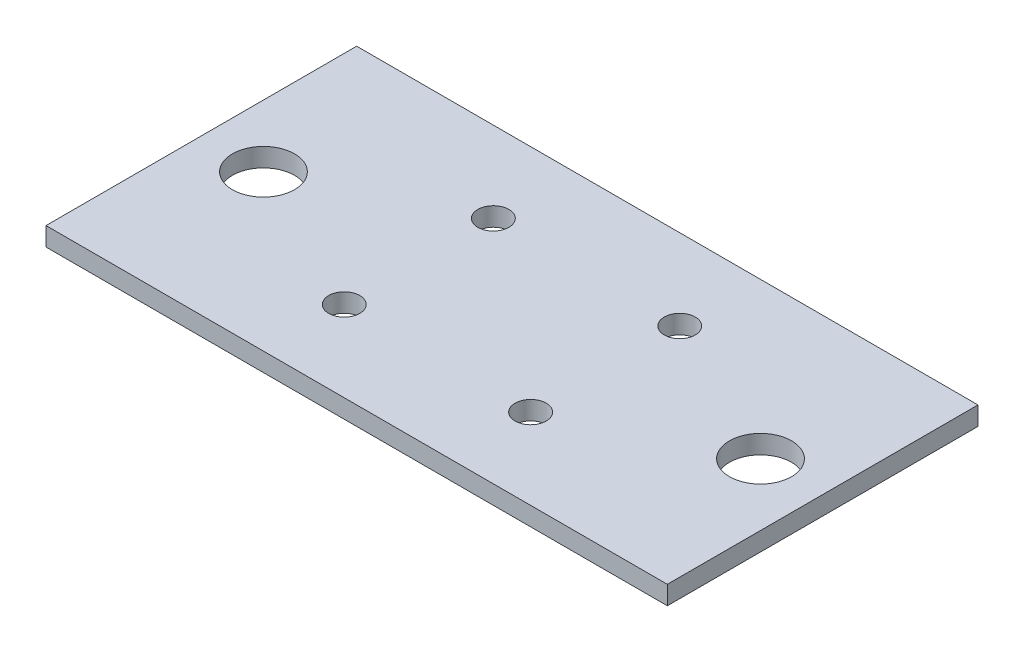
ISO-10303-21;
HEADER;
FILE_DESCRIPTION(('STEP AP214'),'2;1');
FILE_NAME('part.step','',(''),(''),'','','');
FILE_SCHEMA(('AUTOMOTIVE_DESIGN { 1 0 10303 214 1 1 1 1 }'));
ENDSEC;
DATA;
#1=APPLICATION_CONTEXT('core data for automotive mechanical design processes');
#2=APPLICATION_PROTOCOL_DEFINITION('international standard','automotive_design',2000,#1);
#3=PRODUCT_CONTEXT('',#1,'mechanical');
#4=PRODUCT('Part','Part','',(#3));
#5=PRODUCT_RELATED_PRODUCT_CATEGORY('part','',(#4));
#6=PRODUCT_DEFINITION_FORMATION('','',#4);
#7=PRODUCT_DEFINITION_CONTEXT('part definition',#1,'design');
#8=PRODUCT_DEFINITION('design','',#6,#7);
#9=PRODUCT_DEFINITION_SHAPE('','',#8);
#10=(LENGTH_UNIT() NAMED_UNIT(*) SI_UNIT(.MILLI.,.METRE.));
#11=(NAMED_UNIT(*) PLANE_ANGLE_UNIT() SI_UNIT($,.RADIAN.));
#12=(NAMED_UNIT(*) SI_UNIT($,.STERADIAN.) SOLID_ANGLE_UNIT());
#13=UNCERTAINTY_MEASURE_WITH_UNIT(LENGTH_MEASURE(1.E-05),#10,'distance_accuracy_value','');
#14=(GEOMETRIC_REPRESENTATION_CONTEXT(3) GLOBAL_UNCERTAINTY_ASSIGNED_CONTEXT((#13)) GLOBAL_UNIT_ASSIGNED_CONTEXT((#10,
#11,#12)) REPRESENTATION_CONTEXT('',''));
#15=CARTESIAN_POINT('',(0.,0.,0.));
#16=DIRECTION('',(0.,0.,1.));
#17=DIRECTION('',(1.,0.,0.));
#18=AXIS2_PLACEMENT_3D('',#15,#16,#17);
#19=CARTESIAN_POINT('',(50.,3.,-25.));
#20=DIRECTION('',(-1.,0.,0.));
#21=DIRECTION('',(0.,0.,1.));
#22=AXIS2_PLACEMENT_3D('',#19,#20,#21);
#23=PLANE('',#22);
#24=DIRECTION('',(0.,0.,-1.));
#25=VECTOR('',#24,1.);
#26=CARTESIAN_POINT('',(50.,0.,-25.));
#27=LINE('',#26,#25);
#28=CARTESIAN_POINT('',(50.,0.,25.));
#29=VERTEX_POINT('',#28);
#30=CARTESIAN_POINT('',(50.,0.,-25.));
#31=VERTEX_POINT('',#30);
#32=EDGE_CURVE('E96',#29,#31,#27,.T.);
#33=ORIENTED_EDGE('',*,*,#32,.T.);
#34=DIRECTION('',(0.,-1.,0.));
#35=VECTOR('',#34,1.);
#36=CARTESIAN_POINT('',(50.,3.,-25.));
#37=LINE('',#36,#35);
#38=CARTESIAN_POINT('',(50.,3.,-25.));
#39=VERTEX_POINT('',#38);
#40=EDGE_CURVE('E11',#39,#31,#37,.T.);
#41=ORIENTED_EDGE('',*,*,#40,.F.);
#42=DIRECTION('',(0.,0.,-1.));
#43=VECTOR('',#42,1.);
#44=CARTESIAN_POINT('',(50.,3.,-25.));
#45=LINE('',#44,#43);
#46=CARTESIAN_POINT('',(50.,3.,25.));
#47=VERTEX_POINT('',#46);
#48=EDGE_CURVE('E84',#47,#39,#45,.T.);
#49=ORIENTED_EDGE('',*,*,#48,.F.);
#50=DIRECTION('',(0.,-1.,0.));
#51=VECTOR('',#50,1.);
#52=CARTESIAN_POINT('',(50.,3.,25.));
#53=LINE('',#52,#51);
#54=EDGE_CURVE('E92',#47,#29,#53,.T.);
#55=ORIENTED_EDGE('',*,*,#54,.T.);
#56=EDGE_LOOP('',(#33,#41,#49,#55));
#57=FACE_BOUND('',#56,.T.);
#58=ADVANCED_FACE('F33',(#57),#23,.F.);
#59=CARTESIAN_POINT('',(-50.,3.,-25.));
#60=DIRECTION('',(0.,0.,1.));
#61=DIRECTION('',(1.,0.,0.));
#62=AXIS2_PLACEMENT_3D('',#59,#60,#61);
#63=PLANE('',#62);
#64=DIRECTION('',(-1.,0.,0.));
#65=VECTOR('',#64,1.);
#66=CARTESIAN_POINT('',(-50.,0.,-25.));
#67=LINE('',#66,#65);
#68=CARTESIAN_POINT('',(-50.,0.,-25.));
#69=VERTEX_POINT('',#68);
#70=EDGE_CURVE('E88',#31,#69,#67,.T.);
#71=ORIENTED_EDGE('',*,*,#70,.T.);
#72=DIRECTION('',(0.,-1.,0.));
#73=VECTOR('',#72,1.);
#74=CARTESIAN_POINT('',(-50.,3.,-25.));
#75=LINE('',#74,#73);
#76=CARTESIAN_POINT('',(-50.,3.,-25.));
#77=VERTEX_POINT('',#76);
#78=EDGE_CURVE('E41',#77,#69,#75,.T.);
#79=ORIENTED_EDGE('',*,*,#78,.F.);
#80=DIRECTION('',(-1.,0.,0.));
#81=VECTOR('',#80,1.);
#82=CARTESIAN_POINT('',(-50.,3.,-25.));
#83=LINE('',#82,#81);
#84=EDGE_CURVE('E79',#39,#77,#83,.T.);
#85=ORIENTED_EDGE('',*,*,#84,.F.);
#86=ORIENTED_EDGE('',*,*,#40,.T.);
#87=EDGE_LOOP('',(#71,#79,#85,#86));
#88=FACE_BOUND('',#87,.T.);
#89=ADVANCED_FACE('F87',(#88),#63,.F.);
#90=CARTESIAN_POINT('',(-50.,3.,-25.));
#91=DIRECTION('',(1.,0.,0.));
#92=DIRECTION('',(0.,0.,-1.));
#93=AXIS2_PLACEMENT_3D('',#90,#91,#92);
#94=PLANE('',#93);
#95=DIRECTION('',(0.,0.,1.));
#96=VECTOR('',#95,1.);
#97=CARTESIAN_POINT('',(-50.,0.,-25.));
#98=LINE('',#97,#96);
#99=CARTESIAN_POINT('',(-50.,0.,25.));
#100=VERTEX_POINT('',#99);
#101=EDGE_CURVE('E66',#69,#100,#98,.T.);
#102=ORIENTED_EDGE('',*,*,#101,.T.);
#103=DIRECTION('',(0.,-1.,0.));
#104=VECTOR('',#103,1.);
#105=CARTESIAN_POINT('',(-50.,3.,25.));
#106=LINE('',#105,#104);
#107=CARTESIAN_POINT('',(-50.,3.,25.));
#108=VERTEX_POINT('',#107);
#109=EDGE_CURVE('E89',#108,#100,#106,.T.);
#110=ORIENTED_EDGE('',*,*,#109,.F.);
#111=DIRECTION('',(0.,0.,1.));
#112=VECTOR('',#111,1.);
#113=CARTESIAN_POINT('',(-50.,3.,-25.));
#114=LINE('',#113,#112);
#115=EDGE_CURVE('E82',#77,#108,#114,.T.);
#116=ORIENTED_EDGE('',*,*,#115,.F.);
#117=ORIENTED_EDGE('',*,*,#78,.T.);
#118=EDGE_LOOP('',(#102,#110,#116,#117));
#119=FACE_BOUND('',#118,.T.);
#120=ADVANCED_FACE('F90',(#119),#94,.F.);
#121=CARTESIAN_POINT('',(-50.,3.,25.));
#122=DIRECTION('',(0.,0.,-1.));
#123=DIRECTION('',(-1.,0.,0.));
#124=AXIS2_PLACEMENT_3D('',#121,#122,#123);
#125=PLANE('',#124);
#126=DIRECTION('',(1.,0.,0.));
#127=VECTOR('',#126,1.);
#128=CARTESIAN_POINT('',(-50.,0.,25.));
#129=LINE('',#128,#127);
#130=EDGE_CURVE('E72',#100,#29,#129,.T.);
#131=ORIENTED_EDGE('',*,*,#130,.T.);
#132=ORIENTED_EDGE('',*,*,#54,.F.);
#133=DIRECTION('',(1.,0.,0.));
#134=VECTOR('',#133,1.);
#135=CARTESIAN_POINT('',(-50.,3.,25.));
#136=LINE('',#135,#134);
#137=EDGE_CURVE('E49',#108,#47,#136,.T.);
#138=ORIENTED_EDGE('',*,*,#137,.F.);
#139=ORIENTED_EDGE('',*,*,#109,.T.);
#140=EDGE_LOOP('',(#131,#132,#138,#139));
#141=FACE_BOUND('',#140,.T.);
#142=ADVANCED_FACE('F104',(#141),#125,.F.);
#143=CARTESIAN_POINT('',(0.,3.,0.));
#144=DIRECTION('',(0.,1.,0.));
#145=DIRECTION('',(0.,0.,1.));
#146=AXIS2_PLACEMENT_3D('',#143,#144,#145);
#147=PLANE('',#146);
#148=CARTESIAN_POINT('',(-40.,3.,0.));
#149=DIRECTION('',(0.,1.,0.));
#150=DIRECTION('',(0.,0.,1.));
#151=AXIS2_PLACEMENT_3D('',#148,#149,#150);
#152=CIRCLE('',#151,5.);
#153=CARTESIAN_POINT('',(-40.,3.,5.));
#154=VERTEX_POINT('',#153);
#155=EDGE_CURVE('E123',#154,#154,#152,.T.);
#156=ORIENTED_EDGE('',*,*,#155,.F.);
#157=EDGE_LOOP('',(#156));
#158=FACE_BOUND('',#157,.T.);
#159=CARTESIAN_POINT('',(15.,3.,12.));
#160=DIRECTION('',(0.,1.,0.));
#161=DIRECTION('',(0.,0.,1.));
#162=AXIS2_PLACEMENT_3D('',#159,#160,#161);
#163=CIRCLE('',#162,2.5);
#164=CARTESIAN_POINT('',(15.,3.,14.5));
#165=VERTEX_POINT('',#164);
#166=EDGE_CURVE('E136',#165,#165,#163,.T.);
#167=ORIENTED_EDGE('',*,*,#166,.F.);
#168=EDGE_LOOP('',(#167));
#169=FACE_BOUND('',#168,.T.);
#170=CARTESIAN_POINT('',(40.,3.,0.));
#171=DIRECTION('',(0.,1.,0.));
#172=DIRECTION('',(0.,0.,1.));
#173=AXIS2_PLACEMENT_3D('',#170,#171,#172);
#174=CIRCLE('',#173,5.);
#175=CARTESIAN_POINT('',(40.,3.,5.));
#176=VERTEX_POINT('',#175);
#177=EDGE_CURVE('E117',#176,#176,#174,.T.);
#178=ORIENTED_EDGE('',*,*,#177,.F.);
#179=EDGE_LOOP('',(#178));
#180=FACE_BOUND('',#179,.T.);
#181=CARTESIAN_POINT('',(-15.,3.,-12.));
#182=DIRECTION('',(0.,1.,0.));
#183=DIRECTION('',(0.,0.,1.));
#184=AXIS2_PLACEMENT_3D('',#181,#182,#183);
#185=CIRCLE('',#184,2.5);
#186=CARTESIAN_POINT('',(-15.,3.,-9.5));
#187=VERTEX_POINT('',#186);
#188=EDGE_CURVE('E110',#187,#187,#185,.T.);
#189=ORIENTED_EDGE('',*,*,#188,.F.);
#190=EDGE_LOOP('',(#189));
#191=FACE_BOUND('',#190,.T.);
#192=CARTESIAN_POINT('',(-15.,3.,12.));
#193=DIRECTION('',(0.,1.,0.));
#194=DIRECTION('',(0.,0.,1.));
#195=AXIS2_PLACEMENT_3D('',#192,#193,#194);
#196=CIRCLE('',#195,2.5);
#197=CARTESIAN_POINT('',(-15.,3.,14.5));
#198=VERTEX_POINT('',#197);
#199=EDGE_CURVE('E131',#198,#198,#196,.T.);
#200=ORIENTED_EDGE('',*,*,#199,.F.);
#201=EDGE_LOOP('',(#200));
#202=FACE_BOUND('',#201,.T.);
#203=CARTESIAN_POINT('',(15.,3.,-12.));
#204=DIRECTION('',(0.,1.,0.));
#205=DIRECTION('',(0.,0.,1.));
#206=AXIS2_PLACEMENT_3D('',#203,#204,#205);
#207=CIRCLE('',#206,2.5);
#208=CARTESIAN_POINT('',(15.,3.,-9.5));
#209=VERTEX_POINT('',#208);
#210=EDGE_CURVE('E124',#209,#209,#207,.T.);
#211=ORIENTED_EDGE('',*,*,#210,.F.);
#212=EDGE_LOOP('',(#211));
#213=FACE_BOUND('',#212,.T.);
#214=ORIENTED_EDGE('',*,*,#48,.T.);
#215=ORIENTED_EDGE('',*,*,#84,.T.);
#216=ORIENTED_EDGE('',*,*,#115,.T.);
#217=ORIENTED_EDGE('',*,*,#137,.T.);
#218=EDGE_LOOP('',(#214,#215,#216,#217));
#219=FACE_BOUND('',#218,.T.);
#220=ADVANCED_FACE('F80',(#158,#169,#180,#191,#202,#213,#219),#147,.T.);
#221=CARTESIAN_POINT('',(0.,0.,0.));
#222=DIRECTION('',(0.,1.,0.));
#223=DIRECTION('',(0.,0.,1.));
#224=AXIS2_PLACEMENT_3D('',#221,#222,#223);
#225=PLANE('',#224);
#226=CARTESIAN_POINT('',(-40.,0.,0.));
#227=DIRECTION('',(0.,1.,0.));
#228=DIRECTION('',(0.,0.,1.));
#229=AXIS2_PLACEMENT_3D('',#226,#227,#228);
#230=CIRCLE('',#229,5.);
#231=CARTESIAN_POINT('',(-40.,0.,5.));
#232=VERTEX_POINT('',#231);
#233=EDGE_CURVE('E99',#232,#232,#230,.T.);
#234=ORIENTED_EDGE('',*,*,#233,.T.);
#235=EDGE_LOOP('',(#234));
#236=FACE_BOUND('',#235,.T.);
#237=CARTESIAN_POINT('',(15.,0.,12.));
#238=DIRECTION('',(0.,1.,0.));
#239=DIRECTION('',(0.,0.,1.));
#240=AXIS2_PLACEMENT_3D('',#237,#238,#239);
#241=CIRCLE('',#240,2.5);
#242=CARTESIAN_POINT('',(15.,0.,14.5));
#243=VERTEX_POINT('',#242);
#244=EDGE_CURVE('E128',#243,#243,#241,.T.);
#245=ORIENTED_EDGE('',*,*,#244,.T.);
#246=EDGE_LOOP('',(#245));
#247=FACE_BOUND('',#246,.T.);
#248=CARTESIAN_POINT('',(40.,0.,0.));
#249=DIRECTION('',(0.,1.,0.));
#250=DIRECTION('',(0.,0.,1.));
#251=AXIS2_PLACEMENT_3D('',#248,#249,#250);
#252=CIRCLE('',#251,5.);
#253=CARTESIAN_POINT('',(40.,0.,5.));
#254=VERTEX_POINT('',#253);
#255=EDGE_CURVE('E120',#254,#254,#252,.T.);
#256=ORIENTED_EDGE('',*,*,#255,.T.);
#257=EDGE_LOOP('',(#256));
#258=FACE_BOUND('',#257,.T.);
#259=CARTESIAN_POINT('',(-15.,0.,-12.));
#260=DIRECTION('',(0.,1.,0.));
#261=DIRECTION('',(0.,0.,1.));
#262=AXIS2_PLACEMENT_3D('',#259,#260,#261);
#263=CIRCLE('',#262,2.5);
#264=CARTESIAN_POINT('',(-15.,0.,-9.5));
#265=VERTEX_POINT('',#264);
#266=EDGE_CURVE('E113',#265,#265,#263,.T.);
#267=ORIENTED_EDGE('',*,*,#266,.T.);
#268=EDGE_LOOP('',(#267));
#269=FACE_BOUND('',#268,.T.);
#270=CARTESIAN_POINT('',(-15.,0.,12.));
#271=DIRECTION('',(0.,1.,0.));
#272=DIRECTION('',(0.,0.,1.));
#273=AXIS2_PLACEMENT_3D('',#270,#271,#272);
#274=CIRCLE('',#273,2.5);
#275=CARTESIAN_POINT('',(-15.,0.,14.5));
#276=VERTEX_POINT('',#275);
#277=EDGE_CURVE('E114',#276,#276,#274,.T.);
#278=ORIENTED_EDGE('',*,*,#277,.T.);
#279=EDGE_LOOP('',(#278));
#280=FACE_BOUND('',#279,.T.);
#281=CARTESIAN_POINT('',(15.,0.,-12.));
#282=DIRECTION('',(0.,1.,0.));
#283=DIRECTION('',(0.,0.,1.));
#284=AXIS2_PLACEMENT_3D('',#281,#282,#283);
#285=CIRCLE('',#284,2.5);
#286=CARTESIAN_POINT('',(15.,0.,-9.5));
#287=VERTEX_POINT('',#286);
#288=EDGE_CURVE('E127',#287,#287,#285,.T.);
#289=ORIENTED_EDGE('',*,*,#288,.T.);
#290=EDGE_LOOP('',(#289));
#291=FACE_BOUND('',#290,.T.);
#292=ORIENTED_EDGE('',*,*,#32,.F.);
#293=ORIENTED_EDGE('',*,*,#130,.F.);
#294=ORIENTED_EDGE('',*,*,#101,.F.);
#295=ORIENTED_EDGE('',*,*,#70,.F.);
#296=EDGE_LOOP('',(#292,#293,#294,#295));
#297=FACE_BOUND('',#296,.T.);
#298=ADVANCED_FACE('F107',(#236,#247,#258,#269,#280,#291,#297),#225,.F.);
#299=CARTESIAN_POINT('',(15.,0.,-12.));
#300=DIRECTION('',(0.,1.,0.));
#301=DIRECTION('',(0.,0.,1.));
#302=AXIS2_PLACEMENT_3D('',#299,#300,#301);
#303=CYLINDRICAL_SURFACE('',#302,2.5);
#304=ORIENTED_EDGE('',*,*,#288,.F.);
#305=EDGE_LOOP('',(#304));
#306=FACE_BOUND('',#305,.T.);
#307=ORIENTED_EDGE('',*,*,#210,.T.);
#308=EDGE_LOOP('',(#307));
#309=FACE_BOUND('',#308,.T.);
#310=ADVANCED_FACE('F168',(#306,#309),#303,.F.);
#311=CARTESIAN_POINT('',(-15.,0.,12.));
#312=DIRECTION('',(0.,1.,0.));
#313=DIRECTION('',(0.,0.,1.));
#314=AXIS2_PLACEMENT_3D('',#311,#312,#313);
#315=CYLINDRICAL_SURFACE('',#314,2.5);
#316=ORIENTED_EDGE('',*,*,#277,.F.);
#317=EDGE_LOOP('',(#316));
#318=FACE_BOUND('',#317,.T.);
#319=ORIENTED_EDGE('',*,*,#199,.T.);
#320=EDGE_LOOP('',(#319));
#321=FACE_BOUND('',#320,.T.);
#322=ADVANCED_FACE('F170',(#318,#321),#315,.F.);
#323=CARTESIAN_POINT('',(-15.,0.,-12.));
#324=DIRECTION('',(0.,1.,0.));
#325=DIRECTION('',(0.,0.,1.));
#326=AXIS2_PLACEMENT_3D('',#323,#324,#325);
#327=CYLINDRICAL_SURFACE('',#326,2.5);
#328=ORIENTED_EDGE('',*,*,#266,.F.);
#329=EDGE_LOOP('',(#328));
#330=FACE_BOUND('',#329,.T.);
#331=ORIENTED_EDGE('',*,*,#188,.T.);
#332=EDGE_LOOP('',(#331));
#333=FACE_BOUND('',#332,.T.);
#334=ADVANCED_FACE('F177',(#330,#333),#327,.F.);
#335=CARTESIAN_POINT('',(40.,0.,0.));
#336=DIRECTION('',(0.,1.,0.));
#337=DIRECTION('',(0.,0.,1.));
#338=AXIS2_PLACEMENT_3D('',#335,#336,#337);
#339=CYLINDRICAL_SURFACE('',#338,5.);
#340=ORIENTED_EDGE('',*,*,#255,.F.);
#341=EDGE_LOOP('',(#340));
#342=FACE_BOUND('',#341,.T.);
#343=ORIENTED_EDGE('',*,*,#177,.T.);
#344=EDGE_LOOP('',(#343));
#345=FACE_BOUND('',#344,.T.);
#346=ADVANCED_FACE('F195',(#342,#345),#339,.F.);
#347=CARTESIAN_POINT('',(15.,0.,12.));
#348=DIRECTION('',(0.,1.,0.));
#349=DIRECTION('',(0.,0.,1.));
#350=AXIS2_PLACEMENT_3D('',#347,#348,#349);
#351=CYLINDRICAL_SURFACE('',#350,2.5);
#352=ORIENTED_EDGE('',*,*,#244,.F.);
#353=EDGE_LOOP('',(#352));
#354=FACE_BOUND('',#353,.T.);
#355=ORIENTED_EDGE('',*,*,#166,.T.);
#356=EDGE_LOOP('',(#355));
#357=FACE_BOUND('',#356,.T.);
#358=ADVANCED_FACE('F151',(#354,#357),#351,.F.);
#359=CARTESIAN_POINT('',(-40.,0.,0.));
#360=DIRECTION('',(0.,1.,0.));
#361=DIRECTION('',(0.,0.,1.));
#362=AXIS2_PLACEMENT_3D('',#359,#360,#361);
#363=CYLINDRICAL_SURFACE('',#362,5.);
#364=ORIENTED_EDGE('',*,*,#233,.F.);
#365=EDGE_LOOP('',(#364));
#366=FACE_BOUND('',#365,.T.);
#367=ORIENTED_EDGE('',*,*,#155,.T.);
#368=EDGE_LOOP('',(#367));
#369=FACE_BOUND('',#368,.T.);
#370=ADVANCED_FACE('F148',(#366,#369),#363,.F.);
#371=CLOSED_SHELL('',(#58,#89,#120,#142,#220,#298,#310,#322,#334,#346,#358,#370));
#372=MANIFOLD_SOLID_BREP('B2',#371);
#373=ADVANCED_BREP_SHAPE_REPRESENTATION('',(#18,#372),#14);
#374=SHAPE_DEFINITION_REPRESENTATION(#9,#373);
ENDSEC;
END-ISO-10303-21;
